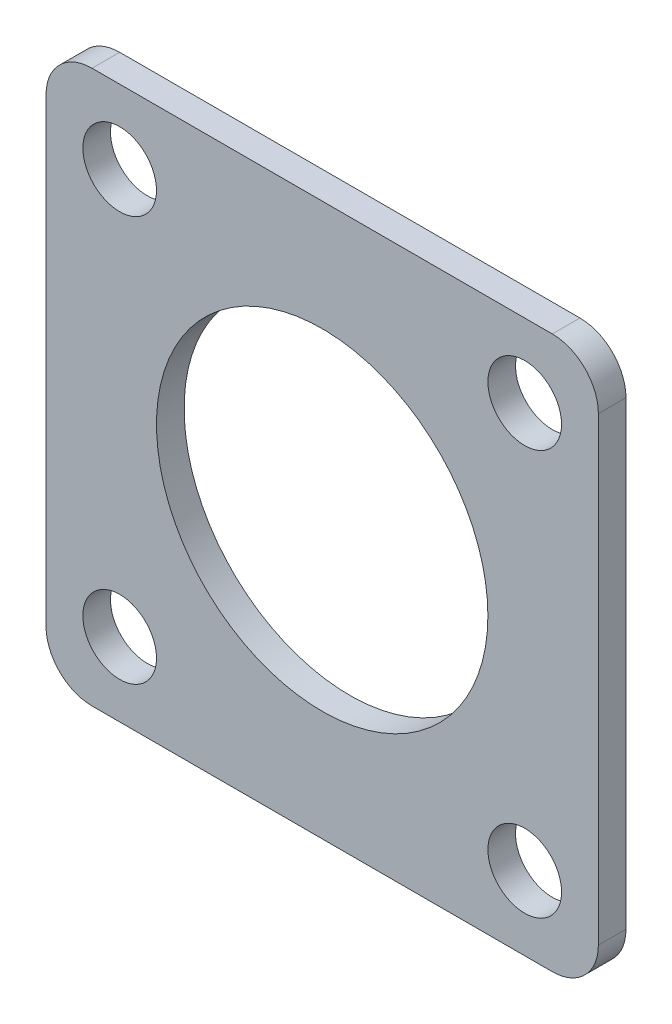
ISO-10303-21;
HEADER;
FILE_DESCRIPTION(('STEP AP214'),'2;1');
FILE_NAME('part.step','',(''),(''),'','','');
FILE_SCHEMA(('AUTOMOTIVE_DESIGN { 1 0 10303 214 1 1 1 1 }'));
ENDSEC;
DATA;
#1=APPLICATION_CONTEXT('core data for automotive mechanical design processes');
#2=APPLICATION_PROTOCOL_DEFINITION('international standard','automotive_design',2000,#1);
#3=PRODUCT_CONTEXT('',#1,'mechanical');
#4=PRODUCT('Part','Part','',(#3));
#5=PRODUCT_RELATED_PRODUCT_CATEGORY('part','',(#4));
#6=PRODUCT_DEFINITION_FORMATION('','',#4);
#7=PRODUCT_DEFINITION_CONTEXT('part definition',#1,'design');
#8=PRODUCT_DEFINITION('design','',#6,#7);
#9=PRODUCT_DEFINITION_SHAPE('','',#8);
#10=(LENGTH_UNIT() NAMED_UNIT(*) SI_UNIT(.MILLI.,.METRE.));
#11=(NAMED_UNIT(*) PLANE_ANGLE_UNIT() SI_UNIT($,.RADIAN.));
#12=(NAMED_UNIT(*) SI_UNIT($,.STERADIAN.) SOLID_ANGLE_UNIT());
#13=UNCERTAINTY_MEASURE_WITH_UNIT(LENGTH_MEASURE(1.E-05),#10,'distance_accuracy_value','');
#14=(GEOMETRIC_REPRESENTATION_CONTEXT(3) GLOBAL_UNCERTAINTY_ASSIGNED_CONTEXT((#13)) GLOBAL_UNIT_ASSIGNED_CONTEXT((#10,
#11,#12)) REPRESENTATION_CONTEXT('',''));
#15=CARTESIAN_POINT('',(0.,0.,0.));
#16=DIRECTION('',(0.,0.,1.));
#17=DIRECTION('',(1.,0.,0.));
#18=AXIS2_PLACEMENT_3D('',#15,#16,#17);
#19=CARTESIAN_POINT('',(0.,0.,0.));
#20=DIRECTION('',(0.,0.,1.));
#21=DIRECTION('',(1.,0.,0.));
#22=AXIS2_PLACEMENT_3D('',#19,#20,#21);
#23=PLANE('',#22);
#24=CARTESIAN_POINT('',(-2.2,2.2,0.));
#25=DIRECTION('',(0.,0.,1.));
#26=DIRECTION('',(1.,0.,0.));
#27=AXIS2_PLACEMENT_3D('',#24,#25,#26);
#28=CIRCLE('',#27,0.4);
#29=CARTESIAN_POINT('',(-1.8,2.2,0.));
#30=VERTEX_POINT('',#29);
#31=EDGE_CURVE('E142',#30,#30,#28,.T.);
#32=ORIENTED_EDGE('',*,*,#31,.T.);
#33=EDGE_LOOP('',(#32));
#34=FACE_BOUND('',#33,.T.);
#35=CARTESIAN_POINT('',(2.2,2.2,0.));
#36=DIRECTION('',(0.,0.,1.));
#37=DIRECTION('',(1.,0.,0.));
#38=AXIS2_PLACEMENT_3D('',#35,#36,#37);
#39=CIRCLE('',#38,0.4);
#40=CARTESIAN_POINT('',(2.6,2.2,0.));
#41=VERTEX_POINT('',#40);
#42=EDGE_CURVE('E145',#41,#41,#39,.T.);
#43=ORIENTED_EDGE('',*,*,#42,.T.);
#44=EDGE_LOOP('',(#43));
#45=FACE_BOUND('',#44,.T.);
#46=CARTESIAN_POINT('',(-2.2,-2.2,0.));
#47=DIRECTION('',(0.,0.,1.));
#48=DIRECTION('',(1.,0.,0.));
#49=AXIS2_PLACEMENT_3D('',#46,#47,#48);
#50=CIRCLE('',#49,0.4);
#51=CARTESIAN_POINT('',(-1.8,-2.2,0.));
#52=VERTEX_POINT('',#51);
#53=EDGE_CURVE('E148',#52,#52,#50,.T.);
#54=ORIENTED_EDGE('',*,*,#53,.T.);
#55=EDGE_LOOP('',(#54));
#56=FACE_BOUND('',#55,.T.);
#57=CARTESIAN_POINT('',(2.2,-2.2,0.));
#58=DIRECTION('',(0.,0.,1.));
#59=DIRECTION('',(1.,0.,0.));
#60=AXIS2_PLACEMENT_3D('',#57,#58,#59);
#61=CIRCLE('',#60,0.4);
#62=CARTESIAN_POINT('',(2.6,-2.2,0.));
#63=VERTEX_POINT('',#62);
#64=EDGE_CURVE('E101',#63,#63,#61,.T.);
#65=ORIENTED_EDGE('',*,*,#64,.T.);
#66=EDGE_LOOP('',(#65));
#67=FACE_BOUND('',#66,.T.);
#68=CARTESIAN_POINT('',(0.,0.,0.));
#69=DIRECTION('',(0.,0.,1.));
#70=DIRECTION('',(1.,0.,0.));
#71=AXIS2_PLACEMENT_3D('',#68,#69,#70);
#72=CIRCLE('',#71,1.8);
#73=CARTESIAN_POINT('',(1.8,0.,0.));
#74=VERTEX_POINT('',#73);
#75=EDGE_CURVE('E98',#74,#74,#72,.T.);
#76=ORIENTED_EDGE('',*,*,#75,.T.);
#77=EDGE_LOOP('',(#76));
#78=FACE_BOUND('',#77,.T.);
#79=DIRECTION('',(0.,1.,0.));
#80=VECTOR('',#79,1.);
#81=CARTESIAN_POINT('',(-3.,-3.,0.));
#82=LINE('',#81,#80);
#83=CARTESIAN_POINT('',(-3.,2.5,0.));
#84=VERTEX_POINT('',#83);
#85=CARTESIAN_POINT('',(-3.,-2.5,0.));
#86=VERTEX_POINT('',#85);
#87=EDGE_CURVE('E82',#84,#86,#82,.F.);
#88=ORIENTED_EDGE('',*,*,#87,.F.);
#89=CARTESIAN_POINT('',(-2.5,2.5,0.));
#90=DIRECTION('',(0.,0.,1.));
#91=DIRECTION('',(1.,0.,0.));
#92=AXIS2_PLACEMENT_3D('',#89,#90,#91);
#93=CIRCLE('',#92,0.5);
#94=CARTESIAN_POINT('',(-2.5,3.,0.));
#95=VERTEX_POINT('',#94);
#96=EDGE_CURVE('E95',#95,#84,#93,.T.);
#97=ORIENTED_EDGE('',*,*,#96,.F.);
#98=DIRECTION('',(1.,0.,0.));
#99=VECTOR('',#98,1.);
#100=CARTESIAN_POINT('',(-3.,3.,0.));
#101=LINE('',#100,#99);
#102=CARTESIAN_POINT('',(2.5,3.,0.));
#103=VERTEX_POINT('',#102);
#104=EDGE_CURVE('E107',#103,#95,#101,.F.);
#105=ORIENTED_EDGE('',*,*,#104,.F.);
#106=CARTESIAN_POINT('',(2.5,2.5,0.));
#107=DIRECTION('',(0.,0.,1.));
#108=DIRECTION('',(1.,0.,0.));
#109=AXIS2_PLACEMENT_3D('',#106,#107,#108);
#110=CIRCLE('',#109,0.5);
#111=CARTESIAN_POINT('',(3.,2.5,0.));
#112=VERTEX_POINT('',#111);
#113=EDGE_CURVE('E154',#112,#103,#110,.T.);
#114=ORIENTED_EDGE('',*,*,#113,.F.);
#115=DIRECTION('',(0.,1.,0.));
#116=VECTOR('',#115,1.);
#117=CARTESIAN_POINT('',(3.,3.,0.));
#118=LINE('',#117,#116);
#119=CARTESIAN_POINT('',(3.,-2.5,0.));
#120=VERTEX_POINT('',#119);
#121=EDGE_CURVE('E111',#120,#112,#118,.T.);
#122=ORIENTED_EDGE('',*,*,#121,.F.);
#123=CARTESIAN_POINT('',(2.5,-2.5,0.));
#124=DIRECTION('',(0.,0.,1.));
#125=DIRECTION('',(1.,0.,0.));
#126=AXIS2_PLACEMENT_3D('',#123,#124,#125);
#127=CIRCLE('',#126,0.5);
#128=CARTESIAN_POINT('',(2.5,-3.,0.));
#129=VERTEX_POINT('',#128);
#130=EDGE_CURVE('E155',#129,#120,#127,.T.);
#131=ORIENTED_EDGE('',*,*,#130,.F.);
#132=DIRECTION('',(1.,0.,0.));
#133=VECTOR('',#132,1.);
#134=CARTESIAN_POINT('',(3.,-3.,0.));
#135=LINE('',#134,#133);
#136=CARTESIAN_POINT('',(-2.5,-3.,0.));
#137=VERTEX_POINT('',#136);
#138=EDGE_CURVE('E84',#137,#129,#135,.T.);
#139=ORIENTED_EDGE('',*,*,#138,.F.);
#140=CARTESIAN_POINT('',(-2.5,-2.5,0.));
#141=DIRECTION('',(0.,0.,1.));
#142=DIRECTION('',(1.,0.,0.));
#143=AXIS2_PLACEMENT_3D('',#140,#141,#142);
#144=CIRCLE('',#143,0.5);
#145=EDGE_CURVE('E19',#86,#137,#144,.T.);
#146=ORIENTED_EDGE('',*,*,#145,.F.);
#147=EDGE_LOOP('',(#88,#97,#105,#114,#122,#131,#139,#146));
#148=FACE_BOUND('',#147,.T.);
#149=ADVANCED_FACE('F16',(#34,#45,#56,#67,#78,#148),#23,.F.);
#150=CARTESIAN_POINT('',(-2.5,-2.5,0.));
#151=DIRECTION('',(0.,0.,1.));
#152=DIRECTION('',(1.,0.,0.));
#153=AXIS2_PLACEMENT_3D('',#150,#151,#152);
#154=CYLINDRICAL_SURFACE('',#153,0.5);
#155=ORIENTED_EDGE('',*,*,#145,.T.);
#156=DIRECTION('',(0.,0.,-1.));
#157=VECTOR('',#156,1.);
#158=CARTESIAN_POINT('',(-2.5,-3.,0.));
#159=LINE('',#158,#157);
#160=CARTESIAN_POINT('',(-2.5,-3.,0.3));
#161=VERTEX_POINT('',#160);
#162=EDGE_CURVE('E87',#161,#137,#159,.T.);
#163=ORIENTED_EDGE('',*,*,#162,.F.);
#164=CARTESIAN_POINT('',(-2.5,-2.5,0.3));
#165=DIRECTION('',(0.,0.,1.));
#166=DIRECTION('',(1.,0.,0.));
#167=AXIS2_PLACEMENT_3D('',#164,#165,#166);
#168=CIRCLE('',#167,0.5);
#169=CARTESIAN_POINT('',(-3.,-2.5,0.3));
#170=VERTEX_POINT('',#169);
#171=EDGE_CURVE('E92',#170,#161,#168,.T.);
#172=ORIENTED_EDGE('',*,*,#171,.F.);
#173=DIRECTION('',(0.,0.,1.));
#174=VECTOR('',#173,1.);
#175=CARTESIAN_POINT('',(-3.,-2.5,0.));
#176=LINE('',#175,#174);
#177=EDGE_CURVE('E89',#86,#170,#176,.T.);
#178=ORIENTED_EDGE('',*,*,#177,.F.);
#179=EDGE_LOOP('',(#155,#163,#172,#178));
#180=FACE_BOUND('',#179,.T.);
#181=ADVANCED_FACE('F90',(#180),#154,.T.);
#182=CARTESIAN_POINT('',(3.,-3.,0.));
#183=DIRECTION('',(0.,-1.,0.));
#184=DIRECTION('',(0.,0.,-1.));
#185=AXIS2_PLACEMENT_3D('',#182,#183,#184);
#186=PLANE('',#185);
#187=DIRECTION('',(0.,0.,1.));
#188=VECTOR('',#187,1.);
#189=CARTESIAN_POINT('',(2.5,-3.,0.));
#190=LINE('',#189,#188);
#191=CARTESIAN_POINT('',(2.5,-3.,0.3));
#192=VERTEX_POINT('',#191);
#193=EDGE_CURVE('E115',#192,#129,#190,.F.);
#194=ORIENTED_EDGE('',*,*,#193,.F.);
#195=DIRECTION('',(1.,0.,0.));
#196=VECTOR('',#195,1.);
#197=CARTESIAN_POINT('',(0.,-3.,0.3));
#198=LINE('',#197,#196);
#199=EDGE_CURVE('E140',#161,#192,#198,.T.);
#200=ORIENTED_EDGE('',*,*,#199,.F.);
#201=ORIENTED_EDGE('',*,*,#162,.T.);
#202=ORIENTED_EDGE('',*,*,#138,.T.);
#203=EDGE_LOOP('',(#194,#200,#201,#202));
#204=FACE_BOUND('',#203,.T.);
#205=ADVANCED_FACE('F192',(#204),#186,.T.);
#206=CARTESIAN_POINT('',(2.5,-2.5,0.));
#207=DIRECTION('',(0.,0.,1.));
#208=DIRECTION('',(1.,0.,0.));
#209=AXIS2_PLACEMENT_3D('',#206,#207,#208);
#210=CYLINDRICAL_SURFACE('',#209,0.5);
#211=ORIENTED_EDGE('',*,*,#130,.T.);
#212=DIRECTION('',(0.,0.,-1.));
#213=VECTOR('',#212,1.);
#214=CARTESIAN_POINT('',(3.,-2.5,0.));
#215=LINE('',#214,#213);
#216=CARTESIAN_POINT('',(3.,-2.5,0.3));
#217=VERTEX_POINT('',#216);
#218=EDGE_CURVE('E114',#217,#120,#215,.T.);
#219=ORIENTED_EDGE('',*,*,#218,.F.);
#220=CARTESIAN_POINT('',(2.5,-2.5,0.3));
#221=DIRECTION('',(0.,0.,1.));
#222=DIRECTION('',(1.,0.,0.));
#223=AXIS2_PLACEMENT_3D('',#220,#221,#222);
#224=CIRCLE('',#223,0.5);
#225=EDGE_CURVE('E137',#192,#217,#224,.T.);
#226=ORIENTED_EDGE('',*,*,#225,.F.);
#227=ORIENTED_EDGE('',*,*,#193,.T.);
#228=EDGE_LOOP('',(#211,#219,#226,#227));
#229=FACE_BOUND('',#228,.T.);
#230=ADVANCED_FACE('F189',(#229),#210,.T.);
#231=CARTESIAN_POINT('',(3.,3.,0.));
#232=DIRECTION('',(1.,0.,0.));
#233=DIRECTION('',(0.,0.,-1.));
#234=AXIS2_PLACEMENT_3D('',#231,#232,#233);
#235=PLANE('',#234);
#236=ORIENTED_EDGE('',*,*,#218,.T.);
#237=ORIENTED_EDGE('',*,*,#121,.T.);
#238=DIRECTION('',(0.,0.,1.));
#239=VECTOR('',#238,1.);
#240=CARTESIAN_POINT('',(3.,2.5,0.));
#241=LINE('',#240,#239);
#242=CARTESIAN_POINT('',(3.,2.5,0.3));
#243=VERTEX_POINT('',#242);
#244=EDGE_CURVE('E113',#243,#112,#241,.F.);
#245=ORIENTED_EDGE('',*,*,#244,.F.);
#246=DIRECTION('',(0.,1.,0.));
#247=VECTOR('',#246,1.);
#248=CARTESIAN_POINT('',(3.,0.,0.3));
#249=LINE('',#248,#247);
#250=EDGE_CURVE('E136',#217,#243,#249,.T.);
#251=ORIENTED_EDGE('',*,*,#250,.F.);
#252=EDGE_LOOP('',(#236,#237,#245,#251));
#253=FACE_BOUND('',#252,.T.);
#254=ADVANCED_FACE('F188',(#253),#235,.T.);
#255=CARTESIAN_POINT('',(2.5,2.5,0.));
#256=DIRECTION('',(0.,0.,1.));
#257=DIRECTION('',(1.,0.,0.));
#258=AXIS2_PLACEMENT_3D('',#255,#256,#257);
#259=CYLINDRICAL_SURFACE('',#258,0.5);
#260=ORIENTED_EDGE('',*,*,#113,.T.);
#261=DIRECTION('',(0.,0.,1.));
#262=VECTOR('',#261,1.);
#263=CARTESIAN_POINT('',(2.5,3.,0.));
#264=LINE('',#263,#262);
#265=CARTESIAN_POINT('',(2.5,3.,0.3));
#266=VERTEX_POINT('',#265);
#267=EDGE_CURVE('E110',#266,#103,#264,.F.);
#268=ORIENTED_EDGE('',*,*,#267,.F.);
#269=CARTESIAN_POINT('',(2.5,2.5,0.3));
#270=DIRECTION('',(0.,0.,1.));
#271=DIRECTION('',(1.,0.,0.));
#272=AXIS2_PLACEMENT_3D('',#269,#270,#271);
#273=CIRCLE('',#272,0.5);
#274=EDGE_CURVE('E133',#243,#266,#273,.T.);
#275=ORIENTED_EDGE('',*,*,#274,.F.);
#276=ORIENTED_EDGE('',*,*,#244,.T.);
#277=EDGE_LOOP('',(#260,#268,#275,#276));
#278=FACE_BOUND('',#277,.T.);
#279=ADVANCED_FACE('F185',(#278),#259,.T.);
#280=CARTESIAN_POINT('',(-3.,3.,0.));
#281=DIRECTION('',(0.,1.,0.));
#282=DIRECTION('',(0.,0.,1.));
#283=AXIS2_PLACEMENT_3D('',#280,#281,#282);
#284=PLANE('',#283);
#285=ORIENTED_EDGE('',*,*,#267,.T.);
#286=ORIENTED_EDGE('',*,*,#104,.T.);
#287=DIRECTION('',(0.,0.,1.));
#288=VECTOR('',#287,1.);
#289=CARTESIAN_POINT('',(-2.5,3.,0.));
#290=LINE('',#289,#288);
#291=CARTESIAN_POINT('',(-2.5,3.,0.3));
#292=VERTEX_POINT('',#291);
#293=EDGE_CURVE('E109',#292,#95,#290,.F.);
#294=ORIENTED_EDGE('',*,*,#293,.F.);
#295=DIRECTION('',(1.,0.,0.));
#296=VECTOR('',#295,1.);
#297=CARTESIAN_POINT('',(0.,3.,0.3));
#298=LINE('',#297,#296);
#299=EDGE_CURVE('E132',#266,#292,#298,.F.);
#300=ORIENTED_EDGE('',*,*,#299,.F.);
#301=EDGE_LOOP('',(#285,#286,#294,#300));
#302=FACE_BOUND('',#301,.T.);
#303=ADVANCED_FACE('F180',(#302),#284,.T.);
#304=CARTESIAN_POINT('',(-2.5,2.5,0.));
#305=DIRECTION('',(0.,0.,1.));
#306=DIRECTION('',(1.,0.,0.));
#307=AXIS2_PLACEMENT_3D('',#304,#305,#306);
#308=CYLINDRICAL_SURFACE('',#307,0.5);
#309=ORIENTED_EDGE('',*,*,#96,.T.);
#310=DIRECTION('',(0.,0.,1.));
#311=VECTOR('',#310,1.);
#312=CARTESIAN_POINT('',(-3.,2.5,0.));
#313=LINE('',#312,#311);
#314=CARTESIAN_POINT('',(-3.,2.5,0.3));
#315=VERTEX_POINT('',#314);
#316=EDGE_CURVE('E34',#315,#84,#313,.F.);
#317=ORIENTED_EDGE('',*,*,#316,.F.);
#318=CARTESIAN_POINT('',(-2.5,2.5,0.3));
#319=DIRECTION('',(0.,0.,1.));
#320=DIRECTION('',(1.,0.,0.));
#321=AXIS2_PLACEMENT_3D('',#318,#319,#320);
#322=CIRCLE('',#321,0.5);
#323=EDGE_CURVE('E129',#292,#315,#322,.T.);
#324=ORIENTED_EDGE('',*,*,#323,.F.);
#325=ORIENTED_EDGE('',*,*,#293,.T.);
#326=EDGE_LOOP('',(#309,#317,#324,#325));
#327=FACE_BOUND('',#326,.T.);
#328=ADVANCED_FACE('F178',(#327),#308,.T.);
#329=CARTESIAN_POINT('',(-3.,-3.,0.));
#330=DIRECTION('',(-1.,0.,0.));
#331=DIRECTION('',(0.,0.,1.));
#332=AXIS2_PLACEMENT_3D('',#329,#330,#331);
#333=PLANE('',#332);
#334=ORIENTED_EDGE('',*,*,#316,.T.);
#335=ORIENTED_EDGE('',*,*,#87,.T.);
#336=ORIENTED_EDGE('',*,*,#177,.T.);
#337=DIRECTION('',(0.,1.,0.));
#338=VECTOR('',#337,1.);
#339=CARTESIAN_POINT('',(-3.,0.,0.3));
#340=LINE('',#339,#338);
#341=EDGE_CURVE('E128',#315,#170,#340,.F.);
#342=ORIENTED_EDGE('',*,*,#341,.F.);
#343=EDGE_LOOP('',(#334,#335,#336,#342));
#344=FACE_BOUND('',#343,.T.);
#345=ADVANCED_FACE('F97',(#344),#333,.T.);
#346=CARTESIAN_POINT('',(0.,0.,0.));
#347=DIRECTION('',(0.,0.,1.));
#348=DIRECTION('',(1.,0.,0.));
#349=AXIS2_PLACEMENT_3D('',#346,#347,#348);
#350=CYLINDRICAL_SURFACE('',#349,1.8);
#351=ORIENTED_EDGE('',*,*,#75,.F.);
#352=EDGE_LOOP('',(#351));
#353=FACE_BOUND('',#352,.T.);
#354=CARTESIAN_POINT('',(0.,0.,0.3));
#355=DIRECTION('',(0.,0.,1.));
#356=DIRECTION('',(1.,0.,0.));
#357=AXIS2_PLACEMENT_3D('',#354,#355,#356);
#358=CIRCLE('',#357,1.8);
#359=CARTESIAN_POINT('',(1.8,0.,0.3));
#360=VERTEX_POINT('',#359);
#361=EDGE_CURVE('E125',#360,#360,#358,.F.);
#362=ORIENTED_EDGE('',*,*,#361,.F.);
#363=EDGE_LOOP('',(#362));
#364=FACE_BOUND('',#363,.T.);
#365=ADVANCED_FACE('F223',(#353,#364),#350,.F.);
#366=CARTESIAN_POINT('',(2.2,-2.2,0.));
#367=DIRECTION('',(0.,0.,1.));
#368=DIRECTION('',(1.,0.,0.));
#369=AXIS2_PLACEMENT_3D('',#366,#367,#368);
#370=CYLINDRICAL_SURFACE('',#369,0.4);
#371=ORIENTED_EDGE('',*,*,#64,.F.);
#372=EDGE_LOOP('',(#371));
#373=FACE_BOUND('',#372,.T.);
#374=CARTESIAN_POINT('',(2.2,-2.2,0.3));
#375=DIRECTION('',(0.,0.,1.));
#376=DIRECTION('',(1.,0.,0.));
#377=AXIS2_PLACEMENT_3D('',#374,#375,#376);
#378=CIRCLE('',#377,0.4);
#379=CARTESIAN_POINT('',(2.6,-2.2,0.3));
#380=VERTEX_POINT('',#379);
#381=EDGE_CURVE('E122',#380,#380,#378,.F.);
#382=ORIENTED_EDGE('',*,*,#381,.F.);
#383=EDGE_LOOP('',(#382));
#384=FACE_BOUND('',#383,.T.);
#385=ADVANCED_FACE('F219',(#373,#384),#370,.F.);
#386=CARTESIAN_POINT('',(-2.2,-2.2,0.));
#387=DIRECTION('',(0.,0.,1.));
#388=DIRECTION('',(1.,0.,0.));
#389=AXIS2_PLACEMENT_3D('',#386,#387,#388);
#390=CYLINDRICAL_SURFACE('',#389,0.4);
#391=ORIENTED_EDGE('',*,*,#53,.F.);
#392=EDGE_LOOP('',(#391));
#393=FACE_BOUND('',#392,.T.);
#394=CARTESIAN_POINT('',(-2.2,-2.2,0.3));
#395=DIRECTION('',(0.,0.,1.));
#396=DIRECTION('',(1.,0.,0.));
#397=AXIS2_PLACEMENT_3D('',#394,#395,#396);
#398=CIRCLE('',#397,0.4);
#399=CARTESIAN_POINT('',(-1.8,-2.2,0.3));
#400=VERTEX_POINT('',#399);
#401=EDGE_CURVE('E119',#400,#400,#398,.F.);
#402=ORIENTED_EDGE('',*,*,#401,.F.);
#403=EDGE_LOOP('',(#402));
#404=FACE_BOUND('',#403,.T.);
#405=ADVANCED_FACE('F215',(#393,#404),#390,.F.);
#406=CARTESIAN_POINT('',(2.2,2.2,0.));
#407=DIRECTION('',(0.,0.,1.));
#408=DIRECTION('',(1.,0.,0.));
#409=AXIS2_PLACEMENT_3D('',#406,#407,#408);
#410=CYLINDRICAL_SURFACE('',#409,0.4);
#411=ORIENTED_EDGE('',*,*,#42,.F.);
#412=EDGE_LOOP('',(#411));
#413=FACE_BOUND('',#412,.T.);
#414=CARTESIAN_POINT('',(2.2,2.2,0.3));
#415=DIRECTION('',(0.,0.,1.));
#416=DIRECTION('',(1.,0.,0.));
#417=AXIS2_PLACEMENT_3D('',#414,#415,#416);
#418=CIRCLE('',#417,0.4);
#419=CARTESIAN_POINT('',(2.6,2.2,0.3));
#420=VERTEX_POINT('',#419);
#421=EDGE_CURVE('E25',#420,#420,#418,.F.);
#422=ORIENTED_EDGE('',*,*,#421,.F.);
#423=EDGE_LOOP('',(#422));
#424=FACE_BOUND('',#423,.T.);
#425=ADVANCED_FACE('F208',(#413,#424),#410,.F.);
#426=CARTESIAN_POINT('',(-2.2,2.2,0.));
#427=DIRECTION('',(0.,0.,1.));
#428=DIRECTION('',(1.,0.,0.));
#429=AXIS2_PLACEMENT_3D('',#426,#427,#428);
#430=CYLINDRICAL_SURFACE('',#429,0.4);
#431=ORIENTED_EDGE('',*,*,#31,.F.);
#432=EDGE_LOOP('',(#431));
#433=FACE_BOUND('',#432,.T.);
#434=CARTESIAN_POINT('',(-2.2,2.2,0.3));
#435=DIRECTION('',(0.,0.,1.));
#436=DIRECTION('',(1.,0.,0.));
#437=AXIS2_PLACEMENT_3D('',#434,#435,#436);
#438=CIRCLE('',#437,0.4);
#439=CARTESIAN_POINT('',(-1.8,2.2,0.3));
#440=VERTEX_POINT('',#439);
#441=EDGE_CURVE('E11',#440,#440,#438,.F.);
#442=ORIENTED_EDGE('',*,*,#441,.F.);
#443=EDGE_LOOP('',(#442));
#444=FACE_BOUND('',#443,.T.);
#445=ADVANCED_FACE('F202',(#433,#444),#430,.F.);
#446=CARTESIAN_POINT('',(0.,0.,0.3));
#447=DIRECTION('',(0.,0.,1.));
#448=DIRECTION('',(1.,0.,0.));
#449=AXIS2_PLACEMENT_3D('',#446,#447,#448);
#450=PLANE('',#449);
#451=ORIENTED_EDGE('',*,*,#441,.T.);
#452=EDGE_LOOP('',(#451));
#453=FACE_BOUND('',#452,.T.);
#454=ORIENTED_EDGE('',*,*,#421,.T.);
#455=EDGE_LOOP('',(#454));
#456=FACE_BOUND('',#455,.T.);
#457=ORIENTED_EDGE('',*,*,#401,.T.);
#458=EDGE_LOOP('',(#457));
#459=FACE_BOUND('',#458,.T.);
#460=ORIENTED_EDGE('',*,*,#381,.T.);
#461=EDGE_LOOP('',(#460));
#462=FACE_BOUND('',#461,.T.);
#463=ORIENTED_EDGE('',*,*,#361,.T.);
#464=EDGE_LOOP('',(#463));
#465=FACE_BOUND('',#464,.T.);
#466=ORIENTED_EDGE('',*,*,#323,.T.);
#467=ORIENTED_EDGE('',*,*,#341,.T.);
#468=ORIENTED_EDGE('',*,*,#171,.T.);
#469=ORIENTED_EDGE('',*,*,#199,.T.);
#470=ORIENTED_EDGE('',*,*,#225,.T.);
#471=ORIENTED_EDGE('',*,*,#250,.T.);
#472=ORIENTED_EDGE('',*,*,#274,.T.);
#473=ORIENTED_EDGE('',*,*,#299,.T.);
#474=EDGE_LOOP('',(#466,#467,#468,#469,#470,#471,#472,#473));
#475=FACE_BOUND('',#474,.T.);
#476=ADVANCED_FACE('F176',(#453,#456,#459,#462,#465,#475),#450,.T.);
#477=CLOSED_SHELL('',(#149,#181,#205,#230,#254,#279,#303,#328,#345,#365,#385,#405,#425,#445,#476));
#478=MANIFOLD_SOLID_BREP('B1',#477);
#479=ADVANCED_BREP_SHAPE_REPRESENTATION('',(#18,#478),#14);
#480=SHAPE_DEFINITION_REPRESENTATION(#9,#479);
ENDSEC;
END-ISO-10303-21;
